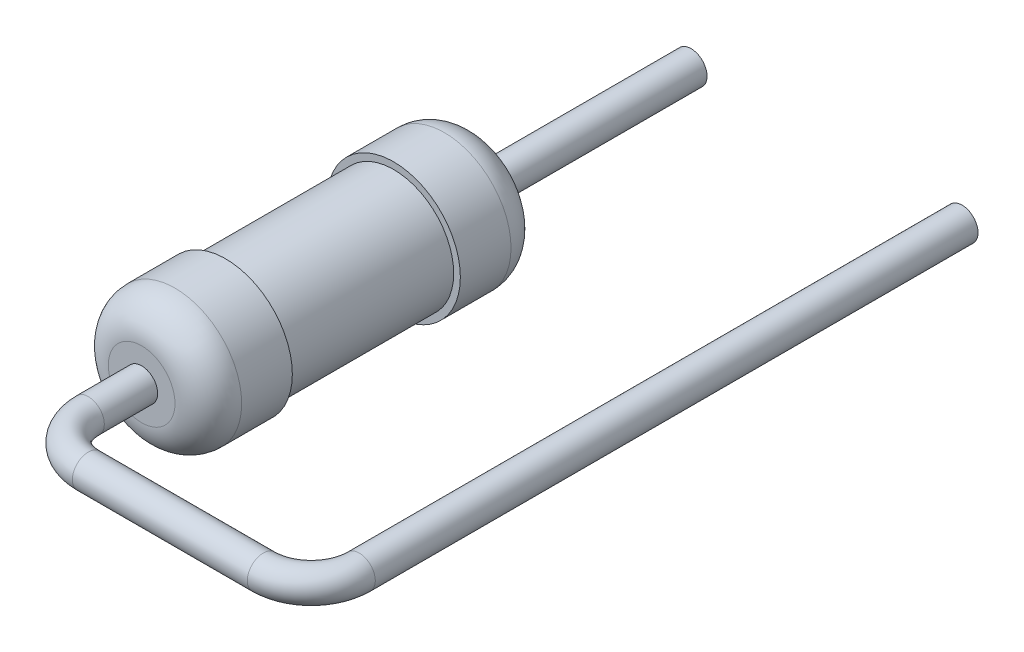
ISO-10303-21;
HEADER;
FILE_DESCRIPTION(('STEP AP214'),'2;1');
FILE_NAME('part.step','',(''),(''),'','','');
FILE_SCHEMA(('AUTOMOTIVE_DESIGN { 1 0 10303 214 1 1 1 1 }'));
ENDSEC;
DATA;
#1=APPLICATION_CONTEXT('core data for automotive mechanical design processes');
#2=APPLICATION_PROTOCOL_DEFINITION('international standard','automotive_design',2000,#1);
#3=PRODUCT_CONTEXT('',#1,'mechanical');
#4=PRODUCT('Part','Part','',(#3));
#5=PRODUCT_RELATED_PRODUCT_CATEGORY('part','',(#4));
#6=PRODUCT_DEFINITION_FORMATION('','',#4);
#7=PRODUCT_DEFINITION_CONTEXT('part definition',#1,'design');
#8=PRODUCT_DEFINITION('design','',#6,#7);
#9=PRODUCT_DEFINITION_SHAPE('','',#8);
#10=(LENGTH_UNIT() NAMED_UNIT(*) SI_UNIT(.MILLI.,.METRE.));
#11=(NAMED_UNIT(*) PLANE_ANGLE_UNIT() SI_UNIT($,.RADIAN.));
#12=(NAMED_UNIT(*) SI_UNIT($,.STERADIAN.) SOLID_ANGLE_UNIT());
#13=UNCERTAINTY_MEASURE_WITH_UNIT(LENGTH_MEASURE(1.E-05),#10,'distance_accuracy_value','');
#14=(GEOMETRIC_REPRESENTATION_CONTEXT(3) GLOBAL_UNCERTAINTY_ASSIGNED_CONTEXT((#13)) GLOBAL_UNIT_ASSIGNED_CONTEXT((#10,
#11,#12)) REPRESENTATION_CONTEXT('',''));
#15=CARTESIAN_POINT('',(0.,0.,0.));
#16=DIRECTION('',(0.,0.,1.));
#17=DIRECTION('',(1.,0.,0.));
#18=AXIS2_PLACEMENT_3D('',#15,#16,#17);
#19=CARTESIAN_POINT('',(0.,0.,1.));
#20=DIRECTION('',(0.,0.,-1.));
#21=DIRECTION('',(1.,0.,0.));
#22=AXIS2_PLACEMENT_3D('',#19,#20,#21);
#23=CYLINDRICAL_SURFACE('',#22,1.25);
#24=CARTESIAN_POINT('',(0.,0.,1.625));
#25=DIRECTION('',(0.,0.,1.));
#26=DIRECTION('',(1.,0.,0.));
#27=AXIS2_PLACEMENT_3D('',#24,#25,#26);
#28=CIRCLE('',#27,1.25);
#29=CARTESIAN_POINT('',(1.25,0.,1.625));
#30=VERTEX_POINT('',#29);
#31=EDGE_CURVE('E11',#30,#30,#28,.T.);
#32=ORIENTED_EDGE('',*,*,#31,.T.);
#33=DIRECTION('',(0.,0.,1.));
#34=VECTOR('',#33,1.);
#35=CARTESIAN_POINT('',(1.25,0.,1.));
#36=LINE('',#35,#34);
#37=CARTESIAN_POINT('',(1.25,0.,2.575));
#38=VERTEX_POINT('',#37);
#39=EDGE_CURVE('E28',#30,#38,#36,.T.);
#40=ORIENTED_EDGE('',*,*,#39,.T.);
#41=CARTESIAN_POINT('',(0.,0.,2.575));
#42=DIRECTION('',(0.,0.,1.));
#43=DIRECTION('',(1.,0.,0.));
#44=AXIS2_PLACEMENT_3D('',#41,#42,#43);
#45=CIRCLE('',#44,1.25);
#46=EDGE_CURVE('E174',#38,#38,#45,.T.);
#47=ORIENTED_EDGE('',*,*,#46,.F.);
#48=ORIENTED_EDGE('',*,*,#39,.F.);
#49=EDGE_LOOP('',(#32,#40,#47,#48));
#50=FACE_BOUND('',#49,.T.);
#51=ADVANCED_FACE('F17',(#50),#23,.T.);
#52=CARTESIAN_POINT('',(0.,0.,1.625));
#53=DIRECTION('',(0.,0.,-1.));
#54=DIRECTION('',(1.,0.,0.));
#55=AXIS2_PLACEMENT_3D('',#52,#53,#54);
#56=DEGENERATE_TOROIDAL_SURFACE('',#55,0.625,0.625,.T.);
#57=CARTESIAN_POINT('',(0.,0.,1.));
#58=DIRECTION('',(0.,0.,1.));
#59=DIRECTION('',(1.,0.,0.));
#60=AXIS2_PLACEMENT_3D('',#57,#58,#59);
#61=CIRCLE('',#60,0.625);
#62=CARTESIAN_POINT('',(0.625,0.,1.));
#63=VERTEX_POINT('',#62);
#64=EDGE_CURVE('E179',#63,#63,#61,.T.);
#65=ORIENTED_EDGE('',*,*,#64,.T.);
#66=CARTESIAN_POINT('',(0.625,0.,1.625));
#67=DIRECTION('',(0.,1.,0.));
#68=DIRECTION('',(1.,0.,0.));
#69=AXIS2_PLACEMENT_3D('',#66,#67,#68);
#70=CIRCLE('',#69,0.625);
#71=EDGE_CURVE('E182',#30,#63,#70,.T.);
#72=ORIENTED_EDGE('',*,*,#71,.F.);
#73=ORIENTED_EDGE('',*,*,#31,.F.);
#74=ORIENTED_EDGE('',*,*,#71,.T.);
#75=EDGE_LOOP('',(#65,#72,#73,#74));
#76=FACE_BOUND('',#75,.T.);
#77=ADVANCED_FACE('F223',(#76),#56,.T.);
#78=CARTESIAN_POINT('',(1.25,0.,2.575));
#79=DIRECTION('',(0.,0.,-1.));
#80=DIRECTION('',(0.,-1.,0.));
#81=AXIS2_PLACEMENT_3D('',#78,#79,#80);
#82=PLANE('',#81);
#83=ORIENTED_EDGE('',*,*,#46,.T.);
#84=EDGE_LOOP('',(#83));
#85=FACE_BOUND('',#84,.T.);
#86=CARTESIAN_POINT('',(0.,0.,2.575));
#87=DIRECTION('',(0.,0.,-1.));
#88=DIRECTION('',(1.,0.,0.));
#89=AXIS2_PLACEMENT_3D('',#86,#87,#88);
#90=CIRCLE('',#89,1.125);
#91=CARTESIAN_POINT('',(1.125,0.,2.575));
#92=VERTEX_POINT('',#91);
#93=EDGE_CURVE('E165',#92,#92,#90,.T.);
#94=ORIENTED_EDGE('',*,*,#93,.T.);
#95=EDGE_LOOP('',(#94));
#96=FACE_BOUND('',#95,.T.);
#97=ADVANCED_FACE('F219',(#85,#96),#82,.F.);
#98=CARTESIAN_POINT('',(1.25,0.,1.));
#99=DIRECTION('',(0.,0.,-1.));
#100=DIRECTION('',(0.,-1.,0.));
#101=AXIS2_PLACEMENT_3D('',#98,#99,#100);
#102=PLANE('',#101);
#103=ORIENTED_EDGE('',*,*,#64,.F.);
#104=EDGE_LOOP('',(#103));
#105=FACE_BOUND('',#104,.T.);
#106=CARTESIAN_POINT('',(0.,0.,1.));
#107=DIRECTION('',(0.,0.,1.));
#108=DIRECTION('',(1.,0.,0.));
#109=AXIS2_PLACEMENT_3D('',#106,#107,#108);
#110=CIRCLE('',#109,0.3);
#111=CARTESIAN_POINT('',(0.3,0.,1.));
#112=VERTEX_POINT('',#111);
#113=EDGE_CURVE('E157',#112,#112,#110,.T.);
#114=ORIENTED_EDGE('',*,*,#113,.T.);
#115=EDGE_LOOP('',(#114));
#116=FACE_BOUND('',#115,.T.);
#117=ADVANCED_FACE('F222',(#105,#116),#102,.T.);
#118=CARTESIAN_POINT('',(0.,0.,1.));
#119=DIRECTION('',(0.,0.,-1.));
#120=DIRECTION('',(1.,0.,0.));
#121=AXIS2_PLACEMENT_3D('',#118,#119,#120);
#122=CYLINDRICAL_SURFACE('',#121,1.125);
#123=CARTESIAN_POINT('',(0.,0.,5.725));
#124=DIRECTION('',(0.,0.,-1.));
#125=DIRECTION('',(1.,0.,0.));
#126=AXIS2_PLACEMENT_3D('',#123,#124,#125);
#127=CIRCLE('',#126,1.125);
#128=CARTESIAN_POINT('',(1.125,0.,5.725));
#129=VERTEX_POINT('',#128);
#130=EDGE_CURVE('E154',#129,#129,#127,.T.);
#131=ORIENTED_EDGE('',*,*,#130,.T.);
#132=DIRECTION('',(0.,0.,1.));
#133=VECTOR('',#132,1.);
#134=CARTESIAN_POINT('',(1.125,0.,1.));
#135=LINE('',#134,#133);
#136=EDGE_CURVE('E141',#92,#129,#135,.T.);
#137=ORIENTED_EDGE('',*,*,#136,.F.);
#138=ORIENTED_EDGE('',*,*,#93,.F.);
#139=ORIENTED_EDGE('',*,*,#136,.T.);
#140=EDGE_LOOP('',(#131,#137,#138,#139));
#141=FACE_BOUND('',#140,.T.);
#142=ADVANCED_FACE('F225',(#141),#122,.T.);
#143=CARTESIAN_POINT('',(0.,0.,-3.));
#144=DIRECTION('',(0.,0.,1.));
#145=DIRECTION('',(1.,0.,0.));
#146=AXIS2_PLACEMENT_3D('',#143,#144,#145);
#147=CYLINDRICAL_SURFACE('',#146,0.3);
#148=CARTESIAN_POINT('',(0.,0.,-3.));
#149=DIRECTION('',(0.,0.,1.));
#150=DIRECTION('',(1.,0.,0.));
#151=AXIS2_PLACEMENT_3D('',#148,#149,#150);
#152=CIRCLE('',#151,0.3);
#153=CARTESIAN_POINT('',(0.3,0.,-3.));
#154=VERTEX_POINT('',#153);
#155=EDGE_CURVE('E138',#154,#154,#152,.T.);
#156=ORIENTED_EDGE('',*,*,#155,.T.);
#157=DIRECTION('',(0.,0.,1.));
#158=VECTOR('',#157,1.);
#159=CARTESIAN_POINT('',(0.3,0.,-3.));
#160=LINE('',#159,#158);
#161=EDGE_CURVE('E142',#154,#112,#160,.T.);
#162=ORIENTED_EDGE('',*,*,#161,.T.);
#163=ORIENTED_EDGE('',*,*,#113,.F.);
#164=ORIENTED_EDGE('',*,*,#161,.F.);
#165=EDGE_LOOP('',(#156,#162,#163,#164));
#166=FACE_BOUND('',#165,.T.);
#167=ADVANCED_FACE('F232',(#166),#147,.T.);
#168=CARTESIAN_POINT('',(1.25,0.,5.725));
#169=DIRECTION('',(0.,0.,-1.));
#170=DIRECTION('',(0.,-1.,0.));
#171=AXIS2_PLACEMENT_3D('',#168,#169,#170);
#172=PLANE('',#171);
#173=CARTESIAN_POINT('',(0.,0.,5.725));
#174=DIRECTION('',(0.,0.,1.));
#175=DIRECTION('',(1.,0.,0.));
#176=AXIS2_PLACEMENT_3D('',#173,#174,#175);
#177=CIRCLE('',#176,1.25);
#178=CARTESIAN_POINT('',(1.25,0.,5.725));
#179=VERTEX_POINT('',#178);
#180=EDGE_CURVE('E183',#179,#179,#177,.T.);
#181=ORIENTED_EDGE('',*,*,#180,.F.);
#182=EDGE_LOOP('',(#181));
#183=FACE_BOUND('',#182,.T.);
#184=ORIENTED_EDGE('',*,*,#130,.F.);
#185=EDGE_LOOP('',(#184));
#186=FACE_BOUND('',#185,.T.);
#187=ADVANCED_FACE('F229',(#183,#186),#172,.T.);
#188=CARTESIAN_POINT('',(0.3,0.,-3.));
#189=DIRECTION('',(0.,0.,-1.));
#190=DIRECTION('',(0.,-1.,0.));
#191=AXIS2_PLACEMENT_3D('',#188,#189,#190);
#192=PLANE('',#191);
#193=ORIENTED_EDGE('',*,*,#155,.F.);
#194=EDGE_LOOP('',(#193));
#195=FACE_BOUND('',#194,.T.);
#196=ADVANCED_FACE('F231',(#195),#192,.T.);
#197=CARTESIAN_POINT('',(0.,0.,5.725));
#198=DIRECTION('',(0.,0.,-1.));
#199=DIRECTION('',(1.,0.,0.));
#200=AXIS2_PLACEMENT_3D('',#197,#198,#199);
#201=CYLINDRICAL_SURFACE('',#200,1.25);
#202=ORIENTED_EDGE('',*,*,#180,.T.);
#203=DIRECTION('',(0.,0.,1.));
#204=VECTOR('',#203,1.);
#205=CARTESIAN_POINT('',(1.25,0.,5.725));
#206=LINE('',#205,#204);
#207=CARTESIAN_POINT('',(1.25,0.,6.675));
#208=VERTEX_POINT('',#207);
#209=EDGE_CURVE('E187',#179,#208,#206,.T.);
#210=ORIENTED_EDGE('',*,*,#209,.T.);
#211=CARTESIAN_POINT('',(0.,0.,6.675));
#212=DIRECTION('',(0.,0.,1.));
#213=DIRECTION('',(1.,0.,0.));
#214=AXIS2_PLACEMENT_3D('',#211,#212,#213);
#215=CIRCLE('',#214,1.25);
#216=EDGE_CURVE('E148',#208,#208,#215,.T.);
#217=ORIENTED_EDGE('',*,*,#216,.F.);
#218=ORIENTED_EDGE('',*,*,#209,.F.);
#219=EDGE_LOOP('',(#202,#210,#217,#218));
#220=FACE_BOUND('',#219,.T.);
#221=ADVANCED_FACE('F242',(#220),#201,.T.);
#222=CARTESIAN_POINT('',(0.,0.,6.675));
#223=DIRECTION('',(0.,0.,1.));
#224=DIRECTION('',(1.,0.,0.));
#225=AXIS2_PLACEMENT_3D('',#222,#223,#224);
#226=DEGENERATE_TOROIDAL_SURFACE('',#225,0.625,0.625,.T.);
#227=CARTESIAN_POINT('',(0.625,0.,6.675));
#228=DIRECTION('',(0.,-1.,0.));
#229=DIRECTION('',(1.,0.,0.));
#230=AXIS2_PLACEMENT_3D('',#227,#228,#229);
#231=CIRCLE('',#230,0.625);
#232=CARTESIAN_POINT('',(0.625,0.,7.3));
#233=VERTEX_POINT('',#232);
#234=EDGE_CURVE('E144',#208,#233,#231,.T.);
#235=ORIENTED_EDGE('',*,*,#234,.F.);
#236=ORIENTED_EDGE('',*,*,#216,.T.);
#237=ORIENTED_EDGE('',*,*,#234,.T.);
#238=CARTESIAN_POINT('',(0.,0.,7.3));
#239=DIRECTION('',(0.,0.,1.));
#240=DIRECTION('',(1.,0.,0.));
#241=AXIS2_PLACEMENT_3D('',#238,#239,#240);
#242=CIRCLE('',#241,0.625);
#243=EDGE_CURVE('E149',#233,#233,#242,.T.);
#244=ORIENTED_EDGE('',*,*,#243,.F.);
#245=EDGE_LOOP('',(#235,#236,#237,#244));
#246=FACE_BOUND('',#245,.T.);
#247=ADVANCED_FACE('F263',(#246),#226,.T.);
#248=CARTESIAN_POINT('',(1.25,0.,7.3));
#249=DIRECTION('',(0.,0.,-1.));
#250=DIRECTION('',(0.,-1.,0.));
#251=AXIS2_PLACEMENT_3D('',#248,#249,#250);
#252=PLANE('',#251);
#253=ORIENTED_EDGE('',*,*,#243,.T.);
#254=EDGE_LOOP('',(#253));
#255=FACE_BOUND('',#254,.T.);
#256=CARTESIAN_POINT('',(0.,0.,7.3));
#257=DIRECTION('',(0.,0.,1.));
#258=DIRECTION('',(1.,0.,0.));
#259=AXIS2_PLACEMENT_3D('',#256,#257,#258);
#260=CIRCLE('',#259,0.3);
#261=CARTESIAN_POINT('',(0.3,0.,7.3));
#262=VERTEX_POINT('',#261);
#263=EDGE_CURVE('E80',#262,#262,#260,.T.);
#264=ORIENTED_EDGE('',*,*,#263,.F.);
#265=EDGE_LOOP('',(#264));
#266=FACE_BOUND('',#265,.T.);
#267=ADVANCED_FACE('F277',(#255,#266),#252,.F.);
#268=CARTESIAN_POINT('',(0.,0.,-3.));
#269=DIRECTION('',(0.,0.,1.));
#270=DIRECTION('',(1.,0.,0.));
#271=AXIS2_PLACEMENT_3D('',#268,#269,#270);
#272=CYLINDRICAL_SURFACE('',#271,0.3);
#273=ORIENTED_EDGE('',*,*,#263,.T.);
#274=DIRECTION('',(0.,0.,1.));
#275=VECTOR('',#274,1.);
#276=CARTESIAN_POINT('',(0.3,0.,-3.));
#277=LINE('',#276,#275);
#278=CARTESIAN_POINT('',(0.3,0.,8.3));
#279=VERTEX_POINT('',#278);
#280=EDGE_CURVE('E21',#262,#279,#277,.T.);
#281=ORIENTED_EDGE('',*,*,#280,.T.);
#282=CARTESIAN_POINT('',(0.,0.,8.3));
#283=DIRECTION('',(0.,0.,1.));
#284=DIRECTION('',(1.,0.,0.));
#285=AXIS2_PLACEMENT_3D('',#282,#283,#284);
#286=CIRCLE('',#285,0.3);
#287=EDGE_CURVE('E94',#279,#279,#286,.T.);
#288=ORIENTED_EDGE('',*,*,#287,.F.);
#289=ORIENTED_EDGE('',*,*,#280,.F.);
#290=EDGE_LOOP('',(#273,#281,#288,#289));
#291=FACE_BOUND('',#290,.T.);
#292=ADVANCED_FACE('F19',(#291),#272,.T.);
#293=CARTESIAN_POINT('',(0.9,0.,8.3));
#294=DIRECTION('',(0.,1.,0.));
#295=DIRECTION('',(-1.,0.,0.));
#296=AXIS2_PLACEMENT_3D('',#293,#294,#295);
#297=TOROIDAL_SURFACE('',#296,0.9,0.3);
#298=CARTESIAN_POINT('',(0.9,0.,8.3));
#299=DIRECTION('',(0.,1.,0.));
#300=DIRECTION('',(-1.,0.,0.));
#301=AXIS2_PLACEMENT_3D('',#298,#299,#300);
#302=CIRCLE('',#301,0.6);
#303=CARTESIAN_POINT('',(0.9,0.,8.9));
#304=VERTEX_POINT('',#303);
#305=EDGE_CURVE('E137',#279,#304,#302,.T.);
#306=ORIENTED_EDGE('',*,*,#305,.T.);
#307=CARTESIAN_POINT('',(0.9,0.,9.2));
#308=DIRECTION('',(-1.,0.,0.));
#309=DIRECTION('',(0.,0.,1.));
#310=AXIS2_PLACEMENT_3D('',#307,#308,#309);
#311=CIRCLE('',#310,0.3);
#312=EDGE_CURVE('E134',#304,#304,#311,.T.);
#313=ORIENTED_EDGE('',*,*,#312,.T.);
#314=ORIENTED_EDGE('',*,*,#305,.F.);
#315=ORIENTED_EDGE('',*,*,#287,.T.);
#316=EDGE_LOOP('',(#306,#313,#314,#315));
#317=FACE_BOUND('',#316,.T.);
#318=ADVANCED_FACE('F281',(#317),#297,.T.);
#319=CARTESIAN_POINT('',(0.9,0.,9.2));
#320=DIRECTION('',(1.,0.,0.));
#321=DIRECTION('',(0.,0.,-1.));
#322=AXIS2_PLACEMENT_3D('',#319,#320,#321);
#323=CYLINDRICAL_SURFACE('',#322,0.3);
#324=DIRECTION('',(1.,0.,0.));
#325=VECTOR('',#324,1.);
#326=CARTESIAN_POINT('',(0.9,0.,8.9));
#327=LINE('',#326,#325);
#328=CARTESIAN_POINT('',(4.18,0.,8.9));
#329=VERTEX_POINT('',#328);
#330=EDGE_CURVE('E129',#304,#329,#327,.T.);
#331=ORIENTED_EDGE('',*,*,#330,.T.);
#332=CARTESIAN_POINT('',(4.18,0.,9.2));
#333=DIRECTION('',(1.,0.,0.));
#334=DIRECTION('',(0.,0.,-1.));
#335=AXIS2_PLACEMENT_3D('',#332,#333,#334);
#336=CIRCLE('',#335,0.3);
#337=EDGE_CURVE('E107',#329,#329,#336,.T.);
#338=ORIENTED_EDGE('',*,*,#337,.F.);
#339=ORIENTED_EDGE('',*,*,#330,.F.);
#340=ORIENTED_EDGE('',*,*,#312,.F.);
#341=EDGE_LOOP('',(#331,#338,#339,#340));
#342=FACE_BOUND('',#341,.T.);
#343=ADVANCED_FACE('F275',(#342),#323,.T.);
#344=CARTESIAN_POINT('',(4.18,0.,8.3));
#345=DIRECTION('',(0.,1.,0.));
#346=DIRECTION('',(0.,0.,1.));
#347=AXIS2_PLACEMENT_3D('',#344,#345,#346);
#348=TOROIDAL_SURFACE('',#347,0.9,0.3);
#349=CARTESIAN_POINT('',(4.18,0.,8.3));
#350=DIRECTION('',(0.,1.,0.));
#351=DIRECTION('',(0.,0.,1.));
#352=AXIS2_PLACEMENT_3D('',#349,#350,#351);
#353=CIRCLE('',#352,0.6);
#354=CARTESIAN_POINT('',(4.78,0.,8.3));
#355=VERTEX_POINT('',#354);
#356=EDGE_CURVE('E123',#329,#355,#353,.T.);
#357=ORIENTED_EDGE('',*,*,#356,.T.);
#358=CARTESIAN_POINT('',(5.08,0.,8.3));
#359=DIRECTION('',(0.,0.,1.));
#360=DIRECTION('',(1.,0.,0.));
#361=AXIS2_PLACEMENT_3D('',#358,#359,#360);
#362=CIRCLE('',#361,0.3);
#363=EDGE_CURVE('E115',#355,#355,#362,.T.);
#364=ORIENTED_EDGE('',*,*,#363,.T.);
#365=ORIENTED_EDGE('',*,*,#356,.F.);
#366=ORIENTED_EDGE('',*,*,#337,.T.);
#367=EDGE_LOOP('',(#357,#364,#365,#366));
#368=FACE_BOUND('',#367,.T.);
#369=ADVANCED_FACE('F260',(#368),#348,.T.);
#370=CARTESIAN_POINT('',(5.08,0.,8.3));
#371=DIRECTION('',(0.,0.,-1.));
#372=DIRECTION('',(-1.,0.,0.));
#373=AXIS2_PLACEMENT_3D('',#370,#371,#372);
#374=CYLINDRICAL_SURFACE('',#373,0.3);
#375=DIRECTION('',(0.,0.,-1.));
#376=VECTOR('',#375,1.);
#377=CARTESIAN_POINT('',(4.78,0.,8.3));
#378=LINE('',#377,#376);
#379=CARTESIAN_POINT('',(4.78,0.,-3.));
#380=VERTEX_POINT('',#379);
#381=EDGE_CURVE('E117',#355,#380,#378,.T.);
#382=ORIENTED_EDGE('',*,*,#381,.T.);
#383=CARTESIAN_POINT('',(5.08,0.,-3.));
#384=DIRECTION('',(0.,0.,-1.));
#385=DIRECTION('',(-1.,0.,0.));
#386=AXIS2_PLACEMENT_3D('',#383,#384,#385);
#387=CIRCLE('',#386,0.3);
#388=EDGE_CURVE('E195',#380,#380,#387,.T.);
#389=ORIENTED_EDGE('',*,*,#388,.F.);
#390=ORIENTED_EDGE('',*,*,#381,.F.);
#391=ORIENTED_EDGE('',*,*,#363,.F.);
#392=EDGE_LOOP('',(#382,#389,#390,#391));
#393=FACE_BOUND('',#392,.T.);
#394=ADVANCED_FACE('F116',(#393),#374,.T.);
#395=CARTESIAN_POINT('',(4.78,0.,-3.));
#396=DIRECTION('',(0.,0.,1.));
#397=DIRECTION('',(1.,0.,0.));
#398=AXIS2_PLACEMENT_3D('',#395,#396,#397);
#399=PLANE('',#398);
#400=ORIENTED_EDGE('',*,*,#388,.T.);
#401=EDGE_LOOP('',(#400));
#402=FACE_BOUND('',#401,.T.);
#403=ADVANCED_FACE('F265',(#402),#399,.F.);
#404=CLOSED_SHELL('',(#51,#77,#97,#117,#142,#167,#187,#196,#221,#247,#267,#292,#318,#343,#369,
#394,#403));
#405=MANIFOLD_SOLID_BREP('B1',#404);
#406=ADVANCED_BREP_SHAPE_REPRESENTATION('',(#18,#405),#14);
#407=SHAPE_DEFINITION_REPRESENTATION(#9,#406);
ENDSEC;
END-ISO-10303-21;
